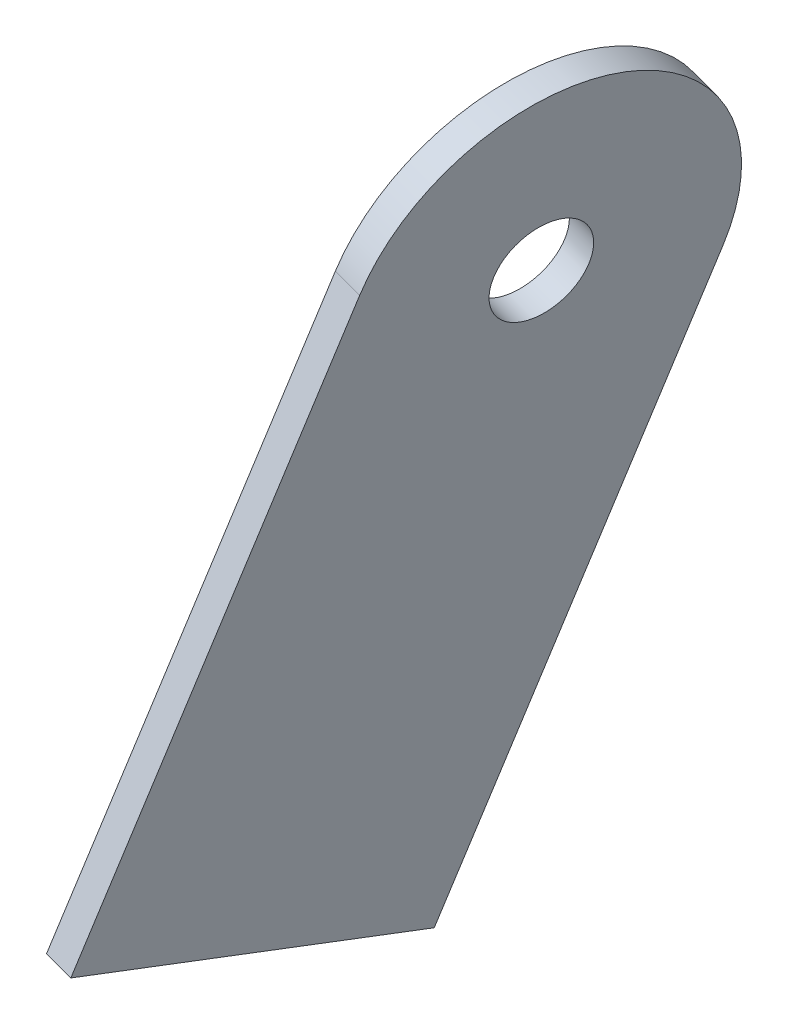
ISO-10303-21;
HEADER;
FILE_DESCRIPTION(('STEP AP214'),'2;1');
FILE_NAME('part.step','',(''),(''),'','','');
FILE_SCHEMA(('AUTOMOTIVE_DESIGN { 1 0 10303 214 1 1 1 1 }'));
ENDSEC;
DATA;
#1=APPLICATION_CONTEXT('core data for automotive mechanical design processes');
#2=APPLICATION_PROTOCOL_DEFINITION('international standard','automotive_design',2000,#1);
#3=PRODUCT_CONTEXT('',#1,'mechanical');
#4=PRODUCT('Part','Part','',(#3));
#5=PRODUCT_RELATED_PRODUCT_CATEGORY('part','',(#4));
#6=PRODUCT_DEFINITION_FORMATION('','',#4);
#7=PRODUCT_DEFINITION_CONTEXT('part definition',#1,'design');
#8=PRODUCT_DEFINITION('design','',#6,#7);
#9=PRODUCT_DEFINITION_SHAPE('','',#8);
#10=(LENGTH_UNIT() NAMED_UNIT(*) SI_UNIT(.MILLI.,.METRE.));
#11=(NAMED_UNIT(*) PLANE_ANGLE_UNIT() SI_UNIT($,.RADIAN.));
#12=(NAMED_UNIT(*) SI_UNIT($,.STERADIAN.) SOLID_ANGLE_UNIT());
#13=UNCERTAINTY_MEASURE_WITH_UNIT(LENGTH_MEASURE(1.E-05),#10,'distance_accuracy_value','');
#14=(GEOMETRIC_REPRESENTATION_CONTEXT(3) GLOBAL_UNCERTAINTY_ASSIGNED_CONTEXT((#13)) GLOBAL_UNIT_ASSIGNED_CONTEXT((#10,
#11,#12)) REPRESENTATION_CONTEXT('',''));
#15=CARTESIAN_POINT('',(0.,0.,0.));
#16=DIRECTION('',(0.,0.,1.));
#17=DIRECTION('',(1.,0.,0.));
#18=AXIS2_PLACEMENT_3D('',#15,#16,#17);
#19=CARTESIAN_POINT('',(-314.633053707191,267.640573472543,-468.377868443316));
#20=DIRECTION('',(0.976357147680202,-0.160922555502941,0.144328276176855));
#21=DIRECTION('',(0.162625264388925,0.986687905764752,0.));
#22=AXIS2_PLACEMENT_3D('',#19,#20,#21);
#23=PLANE('',#22);
#24=DIRECTION('',(-0.0899018191811196,0.304903076080634,0.94813067512052));
#25=VECTOR('',#24,1.);
#26=CARTESIAN_POINT('',(-321.928612314471,239.79700309873,-450.069520532201));
#27=LINE('',#26,#25);
#28=CARTESIAN_POINT('',(-320.21598265907,233.988599499394,-468.131409893248));
#29=VERTEX_POINT('',#28);
#30=CARTESIAN_POINT('',(-321.928612314471,239.79700309873,-450.069520532201));
#31=VERTEX_POINT('',#30);
#32=EDGE_CURVE('E91',#29,#31,#27,.T.);
#33=ORIENTED_EDGE('',*,*,#32,.T.);
#34=DIRECTION('',(0.196581746562862,0.938689536176349,-0.28322706719402));
#35=VECTOR('',#34,1.);
#36=CARTESIAN_POINT('',(-315.489368534891,270.544775272211,-459.346923762793));
#37=LINE('',#36,#35);
#38=CARTESIAN_POINT('',(-315.489368534891,270.544775272211,-459.346923762793));
#39=VERTEX_POINT('',#38);
#40=EDGE_CURVE('E86',#31,#39,#37,.T.);
#41=ORIENTED_EDGE('',*,*,#40,.T.);
#42=CARTESIAN_POINT('',(-314.633053707191,267.640573472543,-468.377868443316));
#43=DIRECTION('',(-0.976357147680202,0.160922555502941,-0.144328276176855));
#44=DIRECTION('',(0.162625264388925,0.986687905764752,0.));
#45=AXIS2_PLACEMENT_3D('',#42,#43,#44);
#46=CIRCLE('',#45,9.52500000000022);
#47=CARTESIAN_POINT('',(-313.776738879491,264.736371672874,-477.408813123839));
#48=VERTEX_POINT('',#47);
#49=EDGE_CURVE('E89',#39,#48,#46,.T.);
#50=ORIENTED_EDGE('',*,*,#49,.T.);
#51=DIRECTION('',(-0.196581746562861,-0.938689536176349,0.28322706719402));
#52=VECTOR('',#51,1.);
#53=CARTESIAN_POINT('',(-320.21598265907,233.988599499394,-468.131409893248));
#54=LINE('',#53,#52);
#55=EDGE_CURVE('E56',#48,#29,#54,.T.);
#56=ORIENTED_EDGE('',*,*,#55,.T.);
#57=EDGE_LOOP('',(#33,#41,#50,#56));
#58=FACE_BOUND('',#57,.T.);
#59=CARTESIAN_POINT('',(-314.633053707191,267.640573472543,-468.377868443316));
#60=DIRECTION('',(-0.976357147680202,0.160922555502941,-0.144328276176855));
#61=DIRECTION('',(-0.162625264388925,-0.986687905764752,0.));
#62=AXIS2_PLACEMENT_3D('',#59,#60,#61);
#63=CIRCLE('',#62,2.48919999999997);
#64=CARTESIAN_POINT('',(-315.037860515308,265.184509937513,-468.377868443316));
#65=VERTEX_POINT('',#64);
#66=EDGE_CURVE('E106',#65,#65,#63,.T.);
#67=ORIENTED_EDGE('',*,*,#66,.F.);
#68=EDGE_LOOP('',(#67));
#69=FACE_BOUND('',#68,.T.);
#70=ADVANCED_FACE('F39',(#58,#69),#23,.F.);
#71=CARTESIAN_POINT('',(-313.083086735249,267.385108915682,-468.148747304885));
#72=DIRECTION('',(0.976357147680202,-0.160922555502941,0.144328276176855));
#73=DIRECTION('',(0.162625264388925,0.986687905764752,0.));
#74=AXIS2_PLACEMENT_3D('',#71,#72,#73);
#75=PLANE('',#74);
#76=DIRECTION('',(-0.0899018191811196,0.304903076080634,0.94813067512052));
#77=VECTOR('',#76,1.);
#78=CARTESIAN_POINT('',(-320.378645342529,239.541538541869,-449.84039939377));
#79=LINE('',#78,#77);
#80=CARTESIAN_POINT('',(-318.666015687128,233.733134942533,-467.902288754817));
#81=VERTEX_POINT('',#80);
#82=CARTESIAN_POINT('',(-320.378645342529,239.541538541869,-449.84039939377));
#83=VERTEX_POINT('',#82);
#84=EDGE_CURVE('E103',#81,#83,#79,.T.);
#85=ORIENTED_EDGE('',*,*,#84,.F.);
#86=DIRECTION('',(-0.196581746562861,-0.938689536176349,0.28322706719402));
#87=VECTOR('',#86,1.);
#88=CARTESIAN_POINT('',(-318.666015687128,233.733134942533,-467.902288754817));
#89=LINE('',#88,#87);
#90=CARTESIAN_POINT('',(-312.226771907549,264.480907116013,-477.179691985408));
#91=VERTEX_POINT('',#90);
#92=EDGE_CURVE('E79',#91,#81,#89,.T.);
#93=ORIENTED_EDGE('',*,*,#92,.F.);
#94=CARTESIAN_POINT('',(-313.083086735249,267.385108915682,-468.148747304885));
#95=DIRECTION('',(-0.976357147680202,0.160922555502941,-0.144328276176855));
#96=DIRECTION('',(0.162625264388925,0.986687905764752,0.));
#97=AXIS2_PLACEMENT_3D('',#94,#95,#96);
#98=CIRCLE('',#97,9.52500000000022);
#99=CARTESIAN_POINT('',(-313.939401562949,270.28931071535,-459.117802624362));
#100=VERTEX_POINT('',#99);
#101=EDGE_CURVE('E73',#100,#91,#98,.T.);
#102=ORIENTED_EDGE('',*,*,#101,.F.);
#103=DIRECTION('',(0.196581746562862,0.938689536176349,-0.28322706719402));
#104=VECTOR('',#103,1.);
#105=CARTESIAN_POINT('',(-313.939401562949,270.28931071535,-459.117802624362));
#106=LINE('',#105,#104);
#107=EDGE_CURVE('E95',#83,#100,#106,.T.);
#108=ORIENTED_EDGE('',*,*,#107,.F.);
#109=EDGE_LOOP('',(#85,#93,#102,#108));
#110=FACE_BOUND('',#109,.T.);
#111=CARTESIAN_POINT('',(-313.083086735249,267.385108915682,-468.148747304885));
#112=DIRECTION('',(-0.976357147680202,0.160922555502941,-0.144328276176855));
#113=DIRECTION('',(-0.162625264388925,-0.986687905764752,0.));
#114=AXIS2_PLACEMENT_3D('',#111,#112,#113);
#115=CIRCLE('',#114,2.48919999999997);
#116=CARTESIAN_POINT('',(-313.487893543366,264.929045380652,-468.148747304885));
#117=VERTEX_POINT('',#116);
#118=EDGE_CURVE('E118',#117,#117,#115,.T.);
#119=ORIENTED_EDGE('',*,*,#118,.T.);
#120=EDGE_LOOP('',(#119));
#121=FACE_BOUND('',#120,.T.);
#122=ADVANCED_FACE('F114',(#110,#121),#75,.T.);
#123=CARTESIAN_POINT('',(-321.928612314471,239.79700309873,-450.069520532201));
#124=DIRECTION('',(0.196581746562862,0.938689536176349,-0.283227067194018));
#125=DIRECTION('',(0.,0.288863534700293,0.957370282764434));
#126=AXIS2_PLACEMENT_3D('',#123,#124,#125);
#127=PLANE('',#126);
#128=ORIENTED_EDGE('',*,*,#84,.T.);
#129=DIRECTION('',(0.976357147680202,-0.160922555502941,0.144328276176856));
#130=VECTOR('',#129,1.);
#131=CARTESIAN_POINT('',(-321.928612314471,239.79700309873,-450.069520532201));
#132=LINE('',#131,#130);
#133=EDGE_CURVE('E11',#31,#83,#132,.T.);
#134=ORIENTED_EDGE('',*,*,#133,.F.);
#135=ORIENTED_EDGE('',*,*,#32,.F.);
#136=DIRECTION('',(0.976357147680202,-0.160922555502941,0.144328276176856));
#137=VECTOR('',#136,1.);
#138=CARTESIAN_POINT('',(-320.21598265907,233.988599499394,-468.131409893248));
#139=LINE('',#138,#137);
#140=EDGE_CURVE('E99',#29,#81,#139,.T.);
#141=ORIENTED_EDGE('',*,*,#140,.T.);
#142=EDGE_LOOP('',(#128,#134,#135,#141));
#143=FACE_BOUND('',#142,.T.);
#144=ADVANCED_FACE('F41',(#143),#127,.F.);
#145=CARTESIAN_POINT('',(-315.489368534891,270.544775272211,-459.346923762793));
#146=DIRECTION('',(0.0899018191811195,-0.304903076080635,-0.948130675120519));
#147=DIRECTION('',(0.,0.951985614474568,-0.306142760543966));
#148=AXIS2_PLACEMENT_3D('',#145,#146,#147);
#149=PLANE('',#148);
#150=ORIENTED_EDGE('',*,*,#107,.T.);
#151=DIRECTION('',(0.976357147680202,-0.160922555502941,0.144328276176856));
#152=VECTOR('',#151,1.);
#153=CARTESIAN_POINT('',(-315.489368534891,270.544775272211,-459.346923762793));
#154=LINE('',#153,#152);
#155=EDGE_CURVE('E48',#39,#100,#154,.T.);
#156=ORIENTED_EDGE('',*,*,#155,.F.);
#157=ORIENTED_EDGE('',*,*,#40,.F.);
#158=ORIENTED_EDGE('',*,*,#133,.T.);
#159=EDGE_LOOP('',(#150,#156,#157,#158));
#160=FACE_BOUND('',#159,.T.);
#161=ADVANCED_FACE('F94',(#160),#149,.F.);
#162=CARTESIAN_POINT('',(-314.633053707191,267.640573472543,-468.377868443316));
#163=DIRECTION('',(0.976357147680202,-0.160922555502941,0.144328276176856));
#164=DIRECTION('',(0.162625264388925,0.986687905764752,0.));
#165=AXIS2_PLACEMENT_3D('',#162,#163,#164);
#166=CYLINDRICAL_SURFACE('',#165,9.52500000000022);
#167=ORIENTED_EDGE('',*,*,#101,.T.);
#168=DIRECTION('',(0.976357147680202,-0.160922555502941,0.144328276176856));
#169=VECTOR('',#168,1.);
#170=CARTESIAN_POINT('',(-313.776738879491,264.736371672874,-477.408813123839));
#171=LINE('',#170,#169);
#172=EDGE_CURVE('E96',#48,#91,#171,.T.);
#173=ORIENTED_EDGE('',*,*,#172,.F.);
#174=ORIENTED_EDGE('',*,*,#49,.F.);
#175=ORIENTED_EDGE('',*,*,#155,.T.);
#176=EDGE_LOOP('',(#167,#173,#174,#175));
#177=FACE_BOUND('',#176,.T.);
#178=ADVANCED_FACE('F97',(#177),#166,.T.);
#179=CARTESIAN_POINT('',(-320.21598265907,233.988599499394,-468.131409893248));
#180=DIRECTION('',(-0.0899018191811194,0.304903076080636,0.948130675120519));
#181=DIRECTION('',(0.,-0.951985614474567,0.306142760543966));
#182=AXIS2_PLACEMENT_3D('',#179,#180,#181);
#183=PLANE('',#182);
#184=ORIENTED_EDGE('',*,*,#92,.T.);
#185=ORIENTED_EDGE('',*,*,#140,.F.);
#186=ORIENTED_EDGE('',*,*,#55,.F.);
#187=ORIENTED_EDGE('',*,*,#172,.T.);
#188=EDGE_LOOP('',(#184,#185,#186,#187));
#189=FACE_BOUND('',#188,.T.);
#190=ADVANCED_FACE('F111',(#189),#183,.F.);
#191=CARTESIAN_POINT('',(-314.633053707191,267.640573472543,-468.377868443316));
#192=DIRECTION('',(0.976357147680202,-0.160922555502941,0.144328276176856));
#193=DIRECTION('',(0.162625264388925,0.986687905764752,0.));
#194=AXIS2_PLACEMENT_3D('',#191,#192,#193);
#195=CYLINDRICAL_SURFACE('',#194,2.48919999999997);
#196=ORIENTED_EDGE('',*,*,#66,.T.);
#197=EDGE_LOOP('',(#196));
#198=FACE_BOUND('',#197,.T.);
#199=ORIENTED_EDGE('',*,*,#118,.F.);
#200=EDGE_LOOP('',(#199));
#201=FACE_BOUND('',#200,.T.);
#202=ADVANCED_FACE('F124',(#198,#201),#195,.F.);
#203=CLOSED_SHELL('',(#70,#122,#144,#161,#178,#190,#202));
#204=MANIFOLD_SOLID_BREP('B2',#203);
#205=ADVANCED_BREP_SHAPE_REPRESENTATION('',(#18,#204),#14);
#206=SHAPE_DEFINITION_REPRESENTATION(#9,#205);
ENDSEC;
END-ISO-10303-21;
